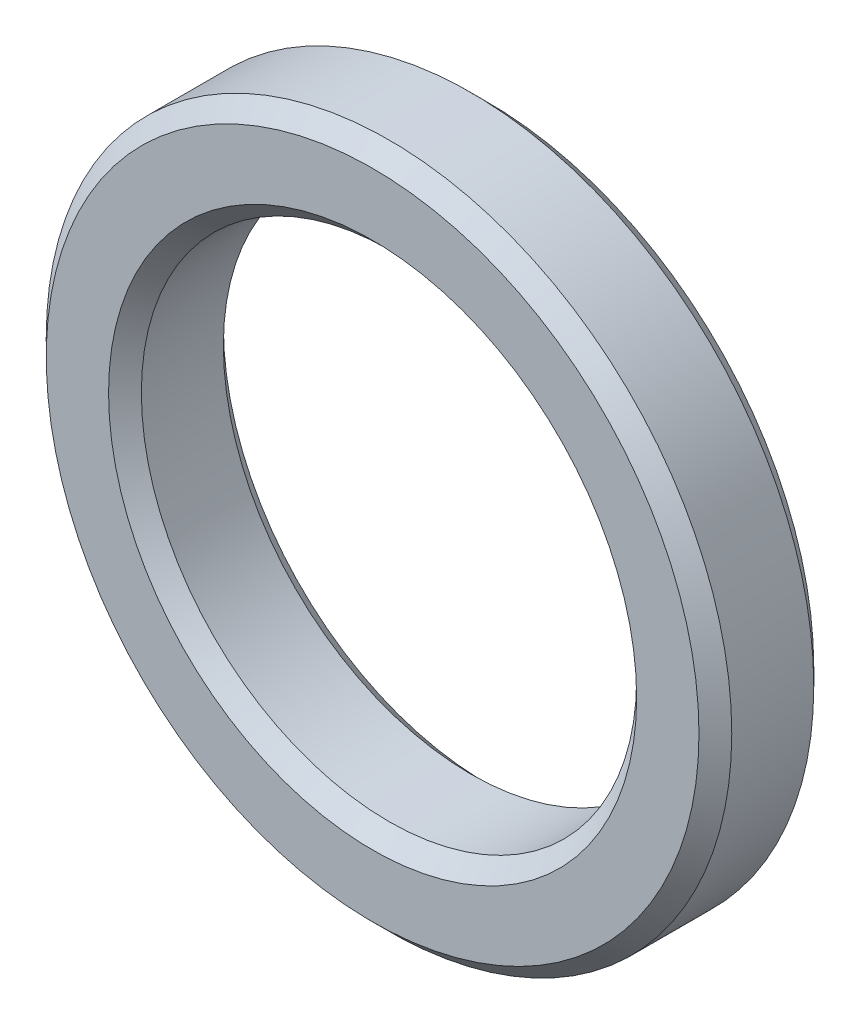
ISO-10303-21;
HEADER;
FILE_DESCRIPTION(('STEP AP214'),'2;1');
FILE_NAME('part.step','',(''),(''),'','','');
FILE_SCHEMA(('AUTOMOTIVE_DESIGN { 1 0 10303 214 1 1 1 1 }'));
ENDSEC;
DATA;
#1=APPLICATION_CONTEXT('core data for automotive mechanical design processes');
#2=APPLICATION_PROTOCOL_DEFINITION('international standard','automotive_design',2000,#1);
#3=PRODUCT_CONTEXT('',#1,'mechanical');
#4=PRODUCT('Part','Part','',(#3));
#5=PRODUCT_RELATED_PRODUCT_CATEGORY('part','',(#4));
#6=PRODUCT_DEFINITION_FORMATION('','',#4);
#7=PRODUCT_DEFINITION_CONTEXT('part definition',#1,'design');
#8=PRODUCT_DEFINITION('design','',#6,#7);
#9=PRODUCT_DEFINITION_SHAPE('','',#8);
#10=(LENGTH_UNIT() NAMED_UNIT(*) SI_UNIT(.MILLI.,.METRE.));
#11=(NAMED_UNIT(*) PLANE_ANGLE_UNIT() SI_UNIT($,.RADIAN.));
#12=(NAMED_UNIT(*) SI_UNIT($,.STERADIAN.) SOLID_ANGLE_UNIT());
#13=UNCERTAINTY_MEASURE_WITH_UNIT(LENGTH_MEASURE(1.E-05),#10,'distance_accuracy_value','');
#14=(GEOMETRIC_REPRESENTATION_CONTEXT(3) GLOBAL_UNCERTAINTY_ASSIGNED_CONTEXT((#13)) GLOBAL_UNIT_ASSIGNED_CONTEXT((#10,
#11,#12)) REPRESENTATION_CONTEXT('',''));
#15=CARTESIAN_POINT('',(0.,0.,0.));
#16=DIRECTION('',(0.,0.,1.));
#17=DIRECTION('',(1.,0.,0.));
#18=AXIS2_PLACEMENT_3D('',#15,#16,#17);
#19=CARTESIAN_POINT('',(0.,0.,0.));
#20=DIRECTION('',(0.,0.,1.));
#21=DIRECTION('',(1.,0.,0.));
#22=AXIS2_PLACEMENT_3D('',#19,#20,#21);
#23=CYLINDRICAL_SURFACE('',#22,15.1);
#24=CARTESIAN_POINT('',(0.,0.,-6.00000000000001));
#25=DIRECTION('',(0.,0.,1.));
#26=DIRECTION('',(1.,0.,0.));
#27=AXIS2_PLACEMENT_3D('',#24,#25,#26);
#28=CIRCLE('',#27,15.1);
#29=CARTESIAN_POINT('',(15.1,0.,-6.00000000000001));
#30=VERTEX_POINT('',#29);
#31=EDGE_CURVE('E58',#30,#30,#28,.T.);
#32=ORIENTED_EDGE('',*,*,#31,.F.);
#33=EDGE_LOOP('',(#32));
#34=FACE_BOUND('',#33,.T.);
#35=CARTESIAN_POINT('',(0.,0.,-1.00000000000001));
#36=DIRECTION('',(0.,0.,1.));
#37=DIRECTION('',(1.,0.,0.));
#38=AXIS2_PLACEMENT_3D('',#35,#36,#37);
#39=CIRCLE('',#38,15.1);
#40=CARTESIAN_POINT('',(15.1,0.,-1.00000000000001));
#41=VERTEX_POINT('',#40);
#42=EDGE_CURVE('E10',#41,#41,#39,.T.);
#43=ORIENTED_EDGE('',*,*,#42,.T.);
#44=EDGE_LOOP('',(#43));
#45=FACE_BOUND('',#44,.T.);
#46=ADVANCED_FACE('F30',(#34,#45),#23,.F.);
#47=CARTESIAN_POINT('',(0.,0.,0.));
#48=DIRECTION('',(0.,0.,1.));
#49=DIRECTION('',(1.,0.,0.));
#50=AXIS2_PLACEMENT_3D('',#47,#48,#49);
#51=CONICAL_SURFACE('',#50,16.1,0.785398163397441);
#52=ORIENTED_EDGE('',*,*,#42,.F.);
#53=EDGE_LOOP('',(#52));
#54=FACE_BOUND('',#53,.T.);
#55=CARTESIAN_POINT('',(0.,0.,0.));
#56=DIRECTION('',(0.,0.,1.));
#57=DIRECTION('',(1.,0.,0.));
#58=AXIS2_PLACEMENT_3D('',#55,#56,#57);
#59=CIRCLE('',#58,16.1);
#60=CARTESIAN_POINT('',(16.1,0.,0.));
#61=VERTEX_POINT('',#60);
#62=EDGE_CURVE('E36',#61,#61,#59,.T.);
#63=ORIENTED_EDGE('',*,*,#62,.T.);
#64=EDGE_LOOP('',(#63));
#65=FACE_BOUND('',#64,.T.);
#66=ADVANCED_FACE('F65',(#54,#65),#51,.F.);
#67=CARTESIAN_POINT('',(0.,16.1,0.));
#68=DIRECTION('',(0.,0.,-1.));
#69=DIRECTION('',(-1.,0.,0.));
#70=AXIS2_PLACEMENT_3D('',#67,#68,#69);
#71=PLANE('',#70);
#72=ORIENTED_EDGE('',*,*,#62,.F.);
#73=EDGE_LOOP('',(#72));
#74=FACE_BOUND('',#73,.T.);
#75=CARTESIAN_POINT('',(0.,0.,0.));
#76=DIRECTION('',(0.,0.,1.));
#77=DIRECTION('',(1.,0.,0.));
#78=AXIS2_PLACEMENT_3D('',#75,#76,#77);
#79=CIRCLE('',#78,19.9);
#80=CARTESIAN_POINT('',(19.9,0.,0.));
#81=VERTEX_POINT('',#80);
#82=EDGE_CURVE('E40',#81,#81,#79,.T.);
#83=ORIENTED_EDGE('',*,*,#82,.T.);
#84=EDGE_LOOP('',(#83));
#85=FACE_BOUND('',#84,.T.);
#86=ADVANCED_FACE('F69',(#74,#85),#71,.F.);
#87=CARTESIAN_POINT('',(0.,0.,-0.999999999999992));
#88=DIRECTION('',(0.,0.,-1.));
#89=DIRECTION('',(-1.,0.,0.));
#90=AXIS2_PLACEMENT_3D('',#87,#88,#89);
#91=CONICAL_SURFACE('',#90,20.9,0.785398163397453);
#92=ORIENTED_EDGE('',*,*,#82,.F.);
#93=EDGE_LOOP('',(#92));
#94=FACE_BOUND('',#93,.T.);
#95=CARTESIAN_POINT('',(0.,0.,-0.999999999999992));
#96=DIRECTION('',(0.,0.,1.));
#97=DIRECTION('',(1.,0.,0.));
#98=AXIS2_PLACEMENT_3D('',#95,#96,#97);
#99=CIRCLE('',#98,20.9);
#100=CARTESIAN_POINT('',(20.9,0.,-0.999999999999992));
#101=VERTEX_POINT('',#100);
#102=EDGE_CURVE('E44',#101,#101,#99,.T.);
#103=ORIENTED_EDGE('',*,*,#102,.T.);
#104=EDGE_LOOP('',(#103));
#105=FACE_BOUND('',#104,.T.);
#106=ADVANCED_FACE('F74',(#94,#105),#91,.T.);
#107=CARTESIAN_POINT('',(0.,0.,0.));
#108=DIRECTION('',(0.,0.,1.));
#109=DIRECTION('',(1.,0.,0.));
#110=AXIS2_PLACEMENT_3D('',#107,#108,#109);
#111=CYLINDRICAL_SURFACE('',#110,20.9);
#112=ORIENTED_EDGE('',*,*,#102,.F.);
#113=EDGE_LOOP('',(#112));
#114=FACE_BOUND('',#113,.T.);
#115=CARTESIAN_POINT('',(0.,0.,-5.99999999999999));
#116=DIRECTION('',(0.,0.,1.));
#117=DIRECTION('',(1.,0.,0.));
#118=AXIS2_PLACEMENT_3D('',#115,#116,#117);
#119=CIRCLE('',#118,20.9);
#120=CARTESIAN_POINT('',(20.9,0.,-5.99999999999999));
#121=VERTEX_POINT('',#120);
#122=EDGE_CURVE('E49',#121,#121,#119,.T.);
#123=ORIENTED_EDGE('',*,*,#122,.T.);
#124=EDGE_LOOP('',(#123));
#125=FACE_BOUND('',#124,.T.);
#126=ADVANCED_FACE('F80',(#114,#125),#111,.T.);
#127=CARTESIAN_POINT('',(0.,0.,-7.));
#128=DIRECTION('',(0.,0.,1.));
#129=DIRECTION('',(1.,0.,0.));
#130=AXIS2_PLACEMENT_3D('',#127,#128,#129);
#131=CONICAL_SURFACE('',#130,19.9,0.785398163397445);
#132=ORIENTED_EDGE('',*,*,#122,.F.);
#133=EDGE_LOOP('',(#132));
#134=FACE_BOUND('',#133,.T.);
#135=CARTESIAN_POINT('',(0.,0.,-7.));
#136=DIRECTION('',(0.,0.,1.));
#137=DIRECTION('',(1.,0.,0.));
#138=AXIS2_PLACEMENT_3D('',#135,#136,#137);
#139=CIRCLE('',#138,19.9);
#140=CARTESIAN_POINT('',(19.9,0.,-7.));
#141=VERTEX_POINT('',#140);
#142=EDGE_CURVE('E52',#141,#141,#139,.T.);
#143=ORIENTED_EDGE('',*,*,#142,.T.);
#144=EDGE_LOOP('',(#143));
#145=FACE_BOUND('',#144,.T.);
#146=ADVANCED_FACE('F84',(#134,#145),#131,.T.);
#147=CARTESIAN_POINT('',(0.,19.9,-7.));
#148=DIRECTION('',(0.,0.,1.));
#149=DIRECTION('',(1.,0.,0.));
#150=AXIS2_PLACEMENT_3D('',#147,#148,#149);
#151=PLANE('',#150);
#152=ORIENTED_EDGE('',*,*,#142,.F.);
#153=EDGE_LOOP('',(#152));
#154=FACE_BOUND('',#153,.T.);
#155=CARTESIAN_POINT('',(0.,0.,-7.));
#156=DIRECTION('',(0.,0.,1.));
#157=DIRECTION('',(1.,0.,0.));
#158=AXIS2_PLACEMENT_3D('',#155,#156,#157);
#159=CIRCLE('',#158,16.1);
#160=CARTESIAN_POINT('',(16.1,0.,-7.));
#161=VERTEX_POINT('',#160);
#162=EDGE_CURVE('E55',#161,#161,#159,.T.);
#163=ORIENTED_EDGE('',*,*,#162,.T.);
#164=EDGE_LOOP('',(#163));
#165=FACE_BOUND('',#164,.T.);
#166=ADVANCED_FACE('F88',(#154,#165),#151,.F.);
#167=CARTESIAN_POINT('',(0.,0.,-6.00000000000001));
#168=DIRECTION('',(0.,0.,-1.));
#169=DIRECTION('',(-1.,0.,0.));
#170=AXIS2_PLACEMENT_3D('',#167,#168,#169);
#171=CONICAL_SURFACE('',#170,15.1,0.785398163397453);
#172=ORIENTED_EDGE('',*,*,#162,.F.);
#173=EDGE_LOOP('',(#172));
#174=FACE_BOUND('',#173,.T.);
#175=ORIENTED_EDGE('',*,*,#31,.T.);
#176=EDGE_LOOP('',(#175));
#177=FACE_BOUND('',#176,.T.);
#178=ADVANCED_FACE('F62',(#174,#177),#171,.F.);
#179=CLOSED_SHELL('',(#46,#66,#86,#106,#126,#146,#166,#178));
#180=MANIFOLD_SOLID_BREP('B2',#179);
#181=ADVANCED_BREP_SHAPE_REPRESENTATION('',(#18,#180),#14);
#182=SHAPE_DEFINITION_REPRESENTATION(#9,#181);
ENDSEC;
END-ISO-10303-21;
